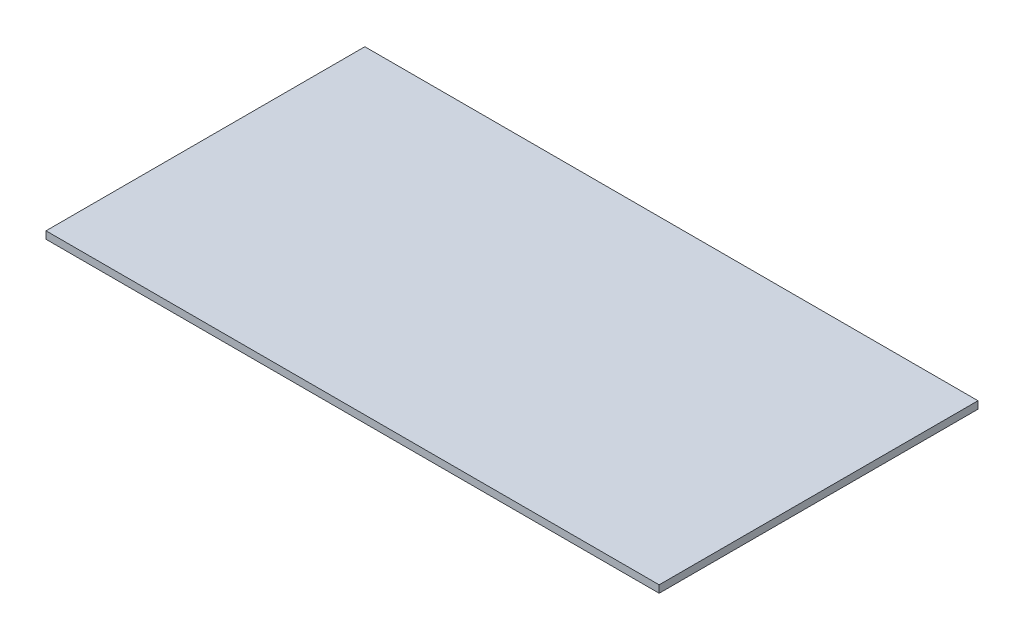
ISO-10303-21;
HEADER;
FILE_DESCRIPTION(('STEP AP214'),'2;1');
FILE_NAME('part.step','',(''),(''),'','','');
FILE_SCHEMA(('AUTOMOTIVE_DESIGN { 1 0 10303 214 1 1 1 1 }'));
ENDSEC;
DATA;
#1=APPLICATION_CONTEXT('core data for automotive mechanical design processes');
#2=APPLICATION_PROTOCOL_DEFINITION('international standard','automotive_design',2000,#1);
#3=PRODUCT_CONTEXT('',#1,'mechanical');
#4=PRODUCT('Part','Part','',(#3));
#5=PRODUCT_RELATED_PRODUCT_CATEGORY('part','',(#4));
#6=PRODUCT_DEFINITION_FORMATION('','',#4);
#7=PRODUCT_DEFINITION_CONTEXT('part definition',#1,'design');
#8=PRODUCT_DEFINITION('design','',#6,#7);
#9=PRODUCT_DEFINITION_SHAPE('','',#8);
#10=(LENGTH_UNIT() NAMED_UNIT(*) SI_UNIT(.MILLI.,.METRE.));
#11=(NAMED_UNIT(*) PLANE_ANGLE_UNIT() SI_UNIT($,.RADIAN.));
#12=(NAMED_UNIT(*) SI_UNIT($,.STERADIAN.) SOLID_ANGLE_UNIT());
#13=UNCERTAINTY_MEASURE_WITH_UNIT(LENGTH_MEASURE(1.E-05),#10,'distance_accuracy_value','');
#14=(GEOMETRIC_REPRESENTATION_CONTEXT(3) GLOBAL_UNCERTAINTY_ASSIGNED_CONTEXT((#13)) GLOBAL_UNIT_ASSIGNED_CONTEXT((#10,
#11,#12)) REPRESENTATION_CONTEXT('',''));
#15=CARTESIAN_POINT('',(0.,0.,0.));
#16=DIRECTION('',(0.,0.,1.));
#17=DIRECTION('',(1.,0.,0.));
#18=AXIS2_PLACEMENT_3D('',#15,#16,#17);
#19=CARTESIAN_POINT('',(125.,3.,-65.));
#20=DIRECTION('',(-1.,0.,0.));
#21=DIRECTION('',(0.,0.,1.));
#22=AXIS2_PLACEMENT_3D('',#19,#20,#21);
#23=PLANE('',#22);
#24=DIRECTION('',(0.,0.,-1.));
#25=VECTOR('',#24,1.);
#26=CARTESIAN_POINT('',(125.,0.,-65.));
#27=LINE('',#26,#25);
#28=CARTESIAN_POINT('',(125.,0.,65.));
#29=VERTEX_POINT('',#28);
#30=CARTESIAN_POINT('',(125.,0.,-65.));
#31=VERTEX_POINT('',#30);
#32=EDGE_CURVE('E107',#29,#31,#27,.T.);
#33=ORIENTED_EDGE('',*,*,#32,.T.);
#34=DIRECTION('',(0.,-1.,0.));
#35=VECTOR('',#34,1.);
#36=CARTESIAN_POINT('',(125.,3.,-65.));
#37=LINE('',#36,#35);
#38=CARTESIAN_POINT('',(125.,3.,-65.));
#39=VERTEX_POINT('',#38);
#40=EDGE_CURVE('E11',#39,#31,#37,.T.);
#41=ORIENTED_EDGE('',*,*,#40,.F.);
#42=DIRECTION('',(0.,0.,-1.));
#43=VECTOR('',#42,1.);
#44=CARTESIAN_POINT('',(125.,3.,-65.));
#45=LINE('',#44,#43);
#46=CARTESIAN_POINT('',(125.,3.,65.));
#47=VERTEX_POINT('',#46);
#48=EDGE_CURVE('E91',#47,#39,#45,.T.);
#49=ORIENTED_EDGE('',*,*,#48,.F.);
#50=DIRECTION('',(0.,-1.,0.));
#51=VECTOR('',#50,1.);
#52=CARTESIAN_POINT('',(125.,3.,65.));
#53=LINE('',#52,#51);
#54=EDGE_CURVE('E103',#47,#29,#53,.T.);
#55=ORIENTED_EDGE('',*,*,#54,.T.);
#56=EDGE_LOOP('',(#33,#41,#49,#55));
#57=FACE_BOUND('',#56,.T.);
#58=ADVANCED_FACE('F39',(#57),#23,.F.);
#59=CARTESIAN_POINT('',(-125.,3.,-65.));
#60=DIRECTION('',(0.,0.,1.));
#61=DIRECTION('',(1.,0.,0.));
#62=AXIS2_PLACEMENT_3D('',#59,#60,#61);
#63=PLANE('',#62);
#64=DIRECTION('',(-1.,0.,0.));
#65=VECTOR('',#64,1.);
#66=CARTESIAN_POINT('',(-125.,0.,-65.));
#67=LINE('',#66,#65);
#68=CARTESIAN_POINT('',(-125.,0.,-65.));
#69=VERTEX_POINT('',#68);
#70=EDGE_CURVE('E96',#31,#69,#67,.T.);
#71=ORIENTED_EDGE('',*,*,#70,.T.);
#72=DIRECTION('',(0.,-1.,0.));
#73=VECTOR('',#72,1.);
#74=CARTESIAN_POINT('',(-125.,3.,-65.));
#75=LINE('',#74,#73);
#76=CARTESIAN_POINT('',(-125.,3.,-65.));
#77=VERTEX_POINT('',#76);
#78=EDGE_CURVE('E48',#77,#69,#75,.T.);
#79=ORIENTED_EDGE('',*,*,#78,.F.);
#80=DIRECTION('',(-1.,0.,0.));
#81=VECTOR('',#80,1.);
#82=CARTESIAN_POINT('',(-125.,3.,-65.));
#83=LINE('',#82,#81);
#84=EDGE_CURVE('E86',#39,#77,#83,.T.);
#85=ORIENTED_EDGE('',*,*,#84,.F.);
#86=ORIENTED_EDGE('',*,*,#40,.T.);
#87=EDGE_LOOP('',(#71,#79,#85,#86));
#88=FACE_BOUND('',#87,.T.);
#89=ADVANCED_FACE('F95',(#88),#63,.F.);
#90=CARTESIAN_POINT('',(-125.,3.,-65.));
#91=DIRECTION('',(1.,0.,0.));
#92=DIRECTION('',(0.,0.,-1.));
#93=AXIS2_PLACEMENT_3D('',#90,#91,#92);
#94=PLANE('',#93);
#95=DIRECTION('',(0.,0.,1.));
#96=VECTOR('',#95,1.);
#97=CARTESIAN_POINT('',(-125.,0.,-65.));
#98=LINE('',#97,#96);
#99=CARTESIAN_POINT('',(-125.,0.,65.));
#100=VERTEX_POINT('',#99);
#101=EDGE_CURVE('E73',#69,#100,#98,.T.);
#102=ORIENTED_EDGE('',*,*,#101,.T.);
#103=DIRECTION('',(0.,-1.,0.));
#104=VECTOR('',#103,1.);
#105=CARTESIAN_POINT('',(-125.,3.,65.));
#106=LINE('',#105,#104);
#107=CARTESIAN_POINT('',(-125.,3.,65.));
#108=VERTEX_POINT('',#107);
#109=EDGE_CURVE('E98',#108,#100,#106,.T.);
#110=ORIENTED_EDGE('',*,*,#109,.F.);
#111=DIRECTION('',(0.,0.,1.));
#112=VECTOR('',#111,1.);
#113=CARTESIAN_POINT('',(-125.,3.,-65.));
#114=LINE('',#113,#112);
#115=EDGE_CURVE('E89',#77,#108,#114,.T.);
#116=ORIENTED_EDGE('',*,*,#115,.F.);
#117=ORIENTED_EDGE('',*,*,#78,.T.);
#118=EDGE_LOOP('',(#102,#110,#116,#117));
#119=FACE_BOUND('',#118,.T.);
#120=ADVANCED_FACE('F99',(#119),#94,.F.);
#121=CARTESIAN_POINT('',(-125.,3.,65.));
#122=DIRECTION('',(0.,0.,-1.));
#123=DIRECTION('',(-1.,0.,0.));
#124=AXIS2_PLACEMENT_3D('',#121,#122,#123);
#125=PLANE('',#124);
#126=DIRECTION('',(1.,0.,0.));
#127=VECTOR('',#126,1.);
#128=CARTESIAN_POINT('',(-125.,0.,65.));
#129=LINE('',#128,#127);
#130=EDGE_CURVE('E79',#100,#29,#129,.T.);
#131=ORIENTED_EDGE('',*,*,#130,.T.);
#132=ORIENTED_EDGE('',*,*,#54,.F.);
#133=DIRECTION('',(1.,0.,0.));
#134=VECTOR('',#133,1.);
#135=CARTESIAN_POINT('',(-125.,3.,65.));
#136=LINE('',#135,#134);
#137=EDGE_CURVE('E56',#108,#47,#136,.T.);
#138=ORIENTED_EDGE('',*,*,#137,.F.);
#139=ORIENTED_EDGE('',*,*,#109,.T.);
#140=EDGE_LOOP('',(#131,#132,#138,#139));
#141=FACE_BOUND('',#140,.T.);
#142=ADVANCED_FACE('F120',(#141),#125,.F.);
#143=CARTESIAN_POINT('',(0.,3.,0.));
#144=DIRECTION('',(0.,1.,0.));
#145=DIRECTION('',(0.,0.,1.));
#146=AXIS2_PLACEMENT_3D('',#143,#144,#145);
#147=PLANE('',#146);
#148=ORIENTED_EDGE('',*,*,#48,.T.);
#149=ORIENTED_EDGE('',*,*,#84,.T.);
#150=ORIENTED_EDGE('',*,*,#115,.T.);
#151=ORIENTED_EDGE('',*,*,#137,.T.);
#152=EDGE_LOOP('',(#148,#149,#150,#151));
#153=FACE_BOUND('',#152,.T.);
#154=ADVANCED_FACE('F87',(#153),#147,.T.);
#155=CARTESIAN_POINT('',(0.,0.,0.));
#156=DIRECTION('',(0.,1.,0.));
#157=DIRECTION('',(0.,0.,1.));
#158=AXIS2_PLACEMENT_3D('',#155,#156,#157);
#159=PLANE('',#158);
#160=ORIENTED_EDGE('',*,*,#32,.F.);
#161=ORIENTED_EDGE('',*,*,#130,.F.);
#162=ORIENTED_EDGE('',*,*,#101,.F.);
#163=ORIENTED_EDGE('',*,*,#70,.F.);
#164=EDGE_LOOP('',(#160,#161,#162,#163));
#165=FACE_BOUND('',#164,.T.);
#166=ADVANCED_FACE('F123',(#165),#159,.F.);
#167=CLOSED_SHELL('',(#58,#89,#120,#142,#154,#166));
#168=MANIFOLD_SOLID_BREP('B2',#167);
#169=ADVANCED_BREP_SHAPE_REPRESENTATION('',(#18,#168),#14);
#170=SHAPE_DEFINITION_REPRESENTATION(#9,#169);
ENDSEC;
END-ISO-10303-21;
